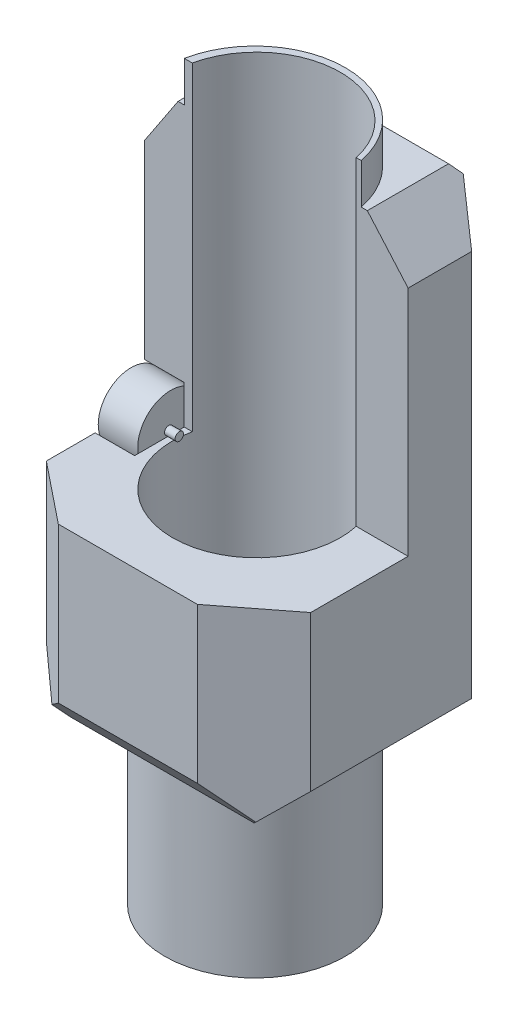
ISO-10303-21;
HEADER;
FILE_DESCRIPTION(('STEP AP214'),'2;1');
FILE_NAME('part.step','',(''),(''),'','','');
FILE_SCHEMA(('AUTOMOTIVE_DESIGN { 1 0 10303 214 1 1 1 1 }'));
ENDSEC;
DATA;
#1=APPLICATION_CONTEXT('core data for automotive mechanical design processes');
#2=APPLICATION_PROTOCOL_DEFINITION('international standard','automotive_design',2000,#1);
#3=PRODUCT_CONTEXT('',#1,'mechanical');
#4=PRODUCT('Part','Part','',(#3));
#5=PRODUCT_RELATED_PRODUCT_CATEGORY('part','',(#4));
#6=PRODUCT_DEFINITION_FORMATION('','',#4);
#7=PRODUCT_DEFINITION_CONTEXT('part definition',#1,'design');
#8=PRODUCT_DEFINITION('design','',#6,#7);
#9=PRODUCT_DEFINITION_SHAPE('','',#8);
#10=(LENGTH_UNIT() NAMED_UNIT(*) SI_UNIT(.MILLI.,.METRE.));
#11=(NAMED_UNIT(*) PLANE_ANGLE_UNIT() SI_UNIT($,.RADIAN.));
#12=(NAMED_UNIT(*) SI_UNIT($,.STERADIAN.) SOLID_ANGLE_UNIT());
#13=UNCERTAINTY_MEASURE_WITH_UNIT(LENGTH_MEASURE(1.E-05),#10,'distance_accuracy_value','');
#14=(GEOMETRIC_REPRESENTATION_CONTEXT(3) GLOBAL_UNCERTAINTY_ASSIGNED_CONTEXT((#13)) GLOBAL_UNIT_ASSIGNED_CONTEXT((#10,
#11,#12)) REPRESENTATION_CONTEXT('',''));
#15=CARTESIAN_POINT('',(0.,0.,0.));
#16=DIRECTION('',(0.,0.,1.));
#17=DIRECTION('',(1.,0.,0.));
#18=AXIS2_PLACEMENT_3D('',#15,#16,#17);
#19=CARTESIAN_POINT('',(0.,180.,0.));
#20=DIRECTION('',(-1.,0.,0.));
#21=DIRECTION('',(0.,0.,1.));
#22=AXIS2_PLACEMENT_3D('',#19,#20,#21);
#23=PLANE('',#22);
#24=DIRECTION('',(0.,0.,1.));
#25=VECTOR('',#24,1.);
#26=CARTESIAN_POINT('',(0.,162.25857257587,0.));
#27=LINE('',#26,#25);
#28=CARTESIAN_POINT('',(0.,162.25857257587,-79.942972796148));
#29=VERTEX_POINT('',#28);
#30=CARTESIAN_POINT('',(0.,162.25857257587,-55.8113966630778));
#31=VERTEX_POINT('',#30);
#32=EDGE_CURVE('E299',#29,#31,#27,.T.);
#33=ORIENTED_EDGE('',*,*,#32,.T.);
#34=DIRECTION('',(0.,-1.,0.));
#35=VECTOR('',#34,1.);
#36=CARTESIAN_POINT('',(0.,180.,-55.8113966630778));
#37=LINE('',#36,#35);
#38=CARTESIAN_POINT('',(0.,74.0838599725127,-55.8113966630778));
#39=VERTEX_POINT('',#38);
#40=EDGE_CURVE('E228',#31,#39,#37,.T.);
#41=ORIENTED_EDGE('',*,*,#40,.T.);
#42=DIRECTION('',(0.,0.,1.));
#43=VECTOR('',#42,1.);
#44=CARTESIAN_POINT('',(0.,74.0838599725127,0.));
#45=LINE('',#44,#43);
#46=CARTESIAN_POINT('',(0.,74.0838599725127,-18.835743686039));
#47=VERTEX_POINT('',#46);
#48=EDGE_CURVE('E216',#39,#47,#45,.T.);
#49=ORIENTED_EDGE('',*,*,#48,.T.);
#50=DIRECTION('',(0.,-1.,0.));
#51=VECTOR('',#50,1.);
#52=CARTESIAN_POINT('',(0.,180.,-18.835743686039));
#53=LINE('',#52,#51);
#54=CARTESIAN_POINT('',(0.,15.2573853040028,-18.835743686039));
#55=VERTEX_POINT('',#54);
#56=EDGE_CURVE('E260',#47,#55,#53,.T.);
#57=ORIENTED_EDGE('',*,*,#56,.T.);
#58=DIRECTION('',(0.,0.,1.));
#59=VECTOR('',#58,1.);
#60=CARTESIAN_POINT('',(0.,15.2573853040028,-400.));
#61=LINE('',#60,#59);
#62=CARTESIAN_POINT('',(0.,15.2573853040028,-79.942972796148));
#63=VERTEX_POINT('',#62);
#64=EDGE_CURVE('E285',#63,#55,#61,.T.);
#65=ORIENTED_EDGE('',*,*,#64,.F.);
#66=DIRECTION('',(0.,1.,0.));
#67=VECTOR('',#66,1.);
#68=CARTESIAN_POINT('',(0.,180.,-79.942972796148));
#69=LINE('',#68,#67);
#70=EDGE_CURVE('E245',#63,#29,#69,.T.);
#71=ORIENTED_EDGE('',*,*,#70,.T.);
#72=EDGE_LOOP('',(#33,#41,#49,#57,#65,#71));
#73=FACE_BOUND('',#72,.T.);
#74=ADVANCED_FACE('F33',(#73),#23,.F.);
#75=CARTESIAN_POINT('',(0.,180.,-100.));
#76=DIRECTION('',(0.,0.,1.));
#77=DIRECTION('',(1.,0.,0.));
#78=AXIS2_PLACEMENT_3D('',#75,#76,#77);
#79=PLANE('',#78);
#80=DIRECTION('',(-1.,0.,0.));
#81=VECTOR('',#80,1.);
#82=CARTESIAN_POINT('',(0.,11.2531638573118,-100.));
#83=LINE('',#82,#81);
#84=CARTESIAN_POINT('',(-26.8680350721203,11.2531638573118,-100.));
#85=VERTEX_POINT('',#84);
#86=CARTESIAN_POINT('',(-78.23623075056,11.2531638573118,-100.));
#87=VERTEX_POINT('',#86);
#88=EDGE_CURVE('E323',#85,#87,#83,.T.);
#89=ORIENTED_EDGE('',*,*,#88,.T.);
#90=DIRECTION('',(0.,1.,0.));
#91=VECTOR('',#90,1.);
#92=CARTESIAN_POINT('',(-78.23623075056,180.,-100.));
#93=LINE('',#92,#91);
#94=CARTESIAN_POINT('',(-78.23623075056,164.310416887307,-100.));
#95=VERTEX_POINT('',#94);
#96=EDGE_CURVE('E276',#87,#95,#93,.T.);
#97=ORIENTED_EDGE('',*,*,#96,.T.);
#98=DIRECTION('',(1.,0.,0.));
#99=VECTOR('',#98,1.);
#100=CARTESIAN_POINT('',(0.,164.310416887307,-100.));
#101=LINE('',#100,#99);
#102=CARTESIAN_POINT('',(-26.8680350721203,164.310416887307,-100.));
#103=VERTEX_POINT('',#102);
#104=EDGE_CURVE('E326',#95,#103,#101,.T.);
#105=ORIENTED_EDGE('',*,*,#104,.T.);
#106=DIRECTION('',(0.,-1.,0.));
#107=VECTOR('',#106,1.);
#108=CARTESIAN_POINT('',(-26.8680350721203,180.,-100.));
#109=LINE('',#108,#107);
#110=EDGE_CURVE('E242',#103,#85,#109,.T.);
#111=ORIENTED_EDGE('',*,*,#110,.T.);
#112=EDGE_LOOP('',(#89,#97,#105,#111));
#113=FACE_BOUND('',#112,.T.);
#114=ADVANCED_FACE('F480',(#113),#79,.F.);
#115=CARTESIAN_POINT('',(-100.,180.,0.));
#116=DIRECTION('',(1.,0.,0.));
#117=DIRECTION('',(0.,0.,-1.));
#118=AXIS2_PLACEMENT_3D('',#115,#116,#117);
#119=PLANE('',#118);
#120=DIRECTION('',(0.,0.,1.));
#121=VECTOR('',#120,1.);
#122=CARTESIAN_POINT('',(-100.,74.0838599725127,-55.8113966630778));
#123=LINE('',#122,#121);
#124=CARTESIAN_POINT('',(-100.,74.0838599725127,-36.9860582028305));
#125=VERTEX_POINT('',#124);
#126=CARTESIAN_POINT('',(-100.,74.0838599725127,-18.4618277268646));
#127=VERTEX_POINT('',#126);
#128=EDGE_CURVE('E409',#125,#127,#123,.T.);
#129=ORIENTED_EDGE('',*,*,#128,.F.);
#130=CARTESIAN_POINT('',(-100.,76.2646461421603,-50.4132519540335));
#131=DIRECTION('',(-1.,0.,0.));
#132=DIRECTION('',(0.,0.,1.));
#133=AXIS2_PLACEMENT_3D('',#130,#131,#132);
#134=CIRCLE('',#133,13.603137886167);
#135=CARTESIAN_POINT('',(-100.,88.7508542955706,-55.8113966630778));
#136=VERTEX_POINT('',#135);
#137=EDGE_CURVE('E455',#136,#125,#134,.T.);
#138=ORIENTED_EDGE('',*,*,#137,.F.);
#139=DIRECTION('',(0.,-1.,0.));
#140=VECTOR('',#139,1.);
#141=CARTESIAN_POINT('',(-100.,74.0838599725127,-55.8113966630778));
#142=LINE('',#141,#140);
#143=CARTESIAN_POINT('',(-100.,160.896793159201,-55.8113966630778));
#144=VERTEX_POINT('',#143);
#145=EDGE_CURVE('E412',#144,#136,#142,.T.);
#146=ORIENTED_EDGE('',*,*,#145,.F.);
#147=DIRECTION('',(0.,0.,-1.));
#148=VECTOR('',#147,1.);
#149=CARTESIAN_POINT('',(-100.,160.896793159201,0.));
#150=LINE('',#149,#148);
#151=CARTESIAN_POINT('',(-100.,160.896793159201,-80.507743362499));
#152=VERTEX_POINT('',#151);
#153=EDGE_CURVE('E310',#144,#152,#150,.T.);
#154=ORIENTED_EDGE('',*,*,#153,.T.);
#155=DIRECTION('',(0.,-1.,0.));
#156=VECTOR('',#155,1.);
#157=CARTESIAN_POINT('',(-100.,180.,-80.507743362499));
#158=LINE('',#157,#156);
#159=CARTESIAN_POINT('',(-100.,14.8474354345408,-80.507743362499));
#160=VERTEX_POINT('',#159);
#161=EDGE_CURVE('E273',#152,#160,#158,.T.);
#162=ORIENTED_EDGE('',*,*,#161,.T.);
#163=DIRECTION('',(0.,0.,1.));
#164=VECTOR('',#163,1.);
#165=CARTESIAN_POINT('',(-100.,14.8474354345408,0.));
#166=LINE('',#165,#164);
#167=CARTESIAN_POINT('',(-100.,14.8474354345408,-18.4618277268646));
#168=VERTEX_POINT('',#167);
#169=EDGE_CURVE('E312',#160,#168,#166,.T.);
#170=ORIENTED_EDGE('',*,*,#169,.T.);
#171=DIRECTION('',(0.,1.,0.));
#172=VECTOR('',#171,1.);
#173=CARTESIAN_POINT('',(-100.,180.,-18.4618277268646));
#174=LINE('',#173,#172);
#175=EDGE_CURVE('E267',#168,#127,#174,.T.);
#176=ORIENTED_EDGE('',*,*,#175,.T.);
#177=EDGE_LOOP('',(#129,#138,#146,#154,#162,#170,#176));
#178=FACE_BOUND('',#177,.T.);
#179=ADVANCED_FACE('F467',(#178),#119,.F.);
#180=CARTESIAN_POINT('',(0.,180.,0.));
#181=DIRECTION('',(0.,0.,-1.));
#182=DIRECTION('',(-1.,0.,0.));
#183=AXIS2_PLACEMENT_3D('',#180,#181,#182);
#184=PLANE('',#183);
#185=DIRECTION('',(0.,1.,0.));
#186=VECTOR('',#185,1.);
#187=CARTESIAN_POINT('',(-24.2126205432622,180.,0.));
#188=LINE('',#187,#186);
#189=CARTESIAN_POINT('',(-24.2126205432622,15.2573853040028,0.));
#190=VERTEX_POINT('',#189);
#191=CARTESIAN_POINT('',(-24.2126205432622,74.0838599725127,0.));
#192=VERTEX_POINT('',#191);
#193=EDGE_CURVE('E257',#190,#192,#188,.T.);
#194=ORIENTED_EDGE('',*,*,#193,.T.);
#195=DIRECTION('',(-1.,0.,0.));
#196=VECTOR('',#195,1.);
#197=CARTESIAN_POINT('',(0.,74.0838599725127,0.));
#198=LINE('',#197,#196);
#199=CARTESIAN_POINT('',(-76.9899954986816,74.0838599725127,0.));
#200=VERTEX_POINT('',#199);
#201=EDGE_CURVE('E418',#192,#200,#198,.T.);
#202=ORIENTED_EDGE('',*,*,#201,.T.);
#203=DIRECTION('',(0.,-1.,0.));
#204=VECTOR('',#203,1.);
#205=CARTESIAN_POINT('',(-76.9899954986816,180.,0.));
#206=LINE('',#205,#204);
#207=CARTESIAN_POINT('',(-76.9899954986816,15.2573853040028,0.));
#208=VERTEX_POINT('',#207);
#209=EDGE_CURVE('E265',#200,#208,#206,.T.);
#210=ORIENTED_EDGE('',*,*,#209,.T.);
#211=DIRECTION('',(1.,0.,0.));
#212=VECTOR('',#211,1.);
#213=CARTESIAN_POINT('',(0.,15.2573853040028,0.));
#214=LINE('',#213,#212);
#215=EDGE_CURVE('E320',#208,#190,#214,.T.);
#216=ORIENTED_EDGE('',*,*,#215,.T.);
#217=EDGE_LOOP('',(#194,#202,#210,#216));
#218=FACE_BOUND('',#217,.T.);
#219=ADVANCED_FACE('F426',(#218),#184,.F.);
#220=CARTESIAN_POINT('',(0.,180.,0.));
#221=DIRECTION('',(0.,1.,0.));
#222=DIRECTION('',(0.,0.,1.));
#223=AXIS2_PLACEMENT_3D('',#220,#221,#222);
#224=PLANE('',#223);
#225=DIRECTION('',(-1.,0.,0.));
#226=VECTOR('',#225,1.);
#227=CARTESIAN_POINT('',(0.,180.,-55.8113966630778));
#228=LINE('',#227,#226);
#229=CARTESIAN_POINT('',(-15.4785584814981,180.,-55.8113966630778));
#230=VERTEX_POINT('',#229);
#231=CARTESIAN_POINT('',(-17.7880398883026,180.,-55.8113966630778));
#232=VERTEX_POINT('',#231);
#233=EDGE_CURVE('E214',#230,#232,#228,.T.);
#234=ORIENTED_EDGE('',*,*,#233,.F.);
#235=DIRECTION('',(0.,0.,1.));
#236=VECTOR('',#235,1.);
#237=CARTESIAN_POINT('',(-15.4785584814982,180.,0.));
#238=LINE('',#237,#236);
#239=CARTESIAN_POINT('',(-15.4785584814982,180.,-86.6502872632608));
#240=VERTEX_POINT('',#239);
#241=EDGE_CURVE('E296',#240,#230,#238,.T.);
#242=ORIENTED_EDGE('',*,*,#241,.F.);
#243=DIRECTION('',(1.,0.,0.));
#244=VECTOR('',#243,1.);
#245=CARTESIAN_POINT('',(0.,180.,-86.6502872632607));
#246=LINE('',#245,#244);
#247=CARTESIAN_POINT('',(-87.3310077399419,180.,-86.6502872632608));
#248=VERTEX_POINT('',#247);
#249=EDGE_CURVE('E340',#248,#240,#246,.T.);
#250=ORIENTED_EDGE('',*,*,#249,.F.);
#251=DIRECTION('',(0.,0.,-1.));
#252=VECTOR('',#251,1.);
#253=CARTESIAN_POINT('',(-87.3310077399419,180.,0.));
#254=LINE('',#253,#252);
#255=CARTESIAN_POINT('',(-87.3310077399419,180.,-55.8113966630778));
#256=VERTEX_POINT('',#255);
#257=EDGE_CURVE('E305',#256,#248,#254,.T.);
#258=ORIENTED_EDGE('',*,*,#257,.F.);
#259=CARTESIAN_POINT('',(-84.9665437781077,180.,-55.8113966630778));
#260=VERTEX_POINT('',#259);
#261=EDGE_CURVE('E220',#260,#256,#228,.T.);
#262=ORIENTED_EDGE('',*,*,#261,.F.);
#263=CARTESIAN_POINT('',(-51.3772918332052,180.,-49.0765363844359));
#264=DIRECTION('',(0.,1.,0.));
#265=DIRECTION('',(0.,0.,1.));
#266=AXIS2_PLACEMENT_3D('',#263,#264,#265);
#267=CIRCLE('',#266,34.2577901971357);
#268=EDGE_CURVE('E329',#260,#232,#267,.F.);
#269=ORIENTED_EDGE('',*,*,#268,.T.);
#270=EDGE_LOOP('',(#234,#242,#250,#258,#262,#269));
#271=FACE_BOUND('',#270,.T.);
#272=ADVANCED_FACE('F523',(#271),#224,.T.);
#273=CARTESIAN_POINT('',(0.,0.,0.));
#274=DIRECTION('',(0.,1.,0.));
#275=DIRECTION('',(0.,0.,1.));
#276=AXIS2_PLACEMENT_3D('',#273,#274,#275);
#277=PLANE('',#276);
#278=DIRECTION('',(1.,0.,0.));
#279=VECTOR('',#278,1.);
#280=CARTESIAN_POINT('',(0.,0.,-86.7744382892866));
#281=LINE('',#280,#279);
#282=CARTESIAN_POINT('',(-85.6232873351068,0.,-86.7744382892867));
#283=VERTEX_POINT('',#282);
#284=CARTESIAN_POINT('',(-15.6949887514202,0.,-86.7744382892866));
#285=VERTEX_POINT('',#284);
#286=EDGE_CURVE('E337',#283,#285,#281,.T.);
#287=ORIENTED_EDGE('',*,*,#286,.T.);
#288=DIRECTION('',(0.,0.,1.));
#289=VECTOR('',#288,1.);
#290=CARTESIAN_POINT('',(-15.6949887514202,0.,-400.));
#291=LINE('',#290,#289);
#292=CARTESIAN_POINT('',(-15.6949887514202,0.,-12.9819708694115));
#293=VERTEX_POINT('',#292);
#294=EDGE_CURVE('E286',#285,#293,#291,.T.);
#295=ORIENTED_EDGE('',*,*,#294,.T.);
#296=DIRECTION('',(-1.,0.,0.));
#297=VECTOR('',#296,1.);
#298=CARTESIAN_POINT('',(0.,0.,-12.9819708694114));
#299=LINE('',#298,#297);
#300=CARTESIAN_POINT('',(-85.6232873351069,0.,-12.9819708694114));
#301=VERTEX_POINT('',#300);
#302=EDGE_CURVE('E334',#293,#301,#299,.T.);
#303=ORIENTED_EDGE('',*,*,#302,.T.);
#304=DIRECTION('',(0.,0.,1.));
#305=VECTOR('',#304,1.);
#306=CARTESIAN_POINT('',(-85.6232873351068,0.,-400.));
#307=LINE('',#306,#305);
#308=CARTESIAN_POINT('',(-85.6232873351068,0.,-48.1776585981388));
#309=VERTEX_POINT('',#308);
#310=EDGE_CURVE('E289',#309,#301,#307,.T.);
#311=ORIENTED_EDGE('',*,*,#310,.F.);
#312=CARTESIAN_POINT('',(-51.3772918332052,0.,-49.0765363844359));
#313=DIRECTION('',(0.,1.,0.));
#314=DIRECTION('',(0.,0.,1.));
#315=AXIS2_PLACEMENT_3D('',#312,#313,#314);
#316=CIRCLE('',#315,34.2577901971357);
#317=CARTESIAN_POINT('',(-85.6232873351068,0.,-49.9754141707329));
#318=VERTEX_POINT('',#317);
#319=EDGE_CURVE('E331',#318,#309,#316,.F.);
#320=ORIENTED_EDGE('',*,*,#319,.F.);
#321=EDGE_CURVE('E295',#283,#318,#307,.T.);
#322=ORIENTED_EDGE('',*,*,#321,.F.);
#323=EDGE_LOOP('',(#287,#295,#303,#311,#320,#322));
#324=FACE_BOUND('',#323,.T.);
#325=ADVANCED_FACE('F493',(#324),#277,.F.);
#326=CARTESIAN_POINT('',(-51.3772918332052,530.,-49.0765363844359));
#327=DIRECTION('',(0.,-1.,0.));
#328=DIRECTION('',(0.,0.,-1.));
#329=AXIS2_PLACEMENT_3D('',#326,#327,#328);
#330=CYLINDRICAL_SURFACE('',#329,34.2577901971357);
#331=CARTESIAN_POINT('',(-51.3772918332052,-62.6813888831705,-49.0765363844359));
#332=DIRECTION('',(0.,1.,0.));
#333=DIRECTION('',(0.,0.,1.));
#334=AXIS2_PLACEMENT_3D('',#331,#332,#333);
#335=CIRCLE('',#334,34.2577901971357);
#336=CARTESIAN_POINT('',(-51.3772918332052,-62.6813888831705,-14.8187461873002));
#337=VERTEX_POINT('',#336);
#338=EDGE_CURVE('E238',#337,#337,#335,.T.);
#339=ORIENTED_EDGE('',*,*,#338,.T.);
#340=EDGE_LOOP('',(#339));
#341=FACE_BOUND('',#340,.T.);
#342=ORIENTED_EDGE('',*,*,#319,.T.);
#343=CARTESIAN_POINT('',(-51.3772918332052,86.1655593743765,-49.0765363844359));
#344=DIRECTION('',(0.929293452580676,-0.369342224760028,0.));
#345=DIRECTION('',(-0.369342224760028,-0.929293452580676,0.));
#346=AXIS2_PLACEMENT_3D('',#343,#344,#345);
#347=ELLIPSE('',#346,92.7535166589576,34.2577901971357);
#348=EDGE_CURVE('E348',#309,#318,#347,.T.);
#349=ORIENTED_EDGE('',*,*,#348,.T.);
#350=EDGE_LOOP('',(#342,#349));
#351=FACE_BOUND('',#350,.T.);
#352=ADVANCED_FACE('F497',(#341,#351),#330,.T.);
#353=DIRECTION('',(0.,-1.,0.));
#354=VECTOR('',#353,1.);
#355=CARTESIAN_POINT('',(-84.9665437781077,530.,-55.8113966630778));
#356=LINE('',#355,#354);
#357=CARTESIAN_POINT('',(-84.9665437781077,195.325913024433,-55.8113966630778));
#358=VERTEX_POINT('',#357);
#359=EDGE_CURVE('E209',#260,#358,#356,.F.);
#360=ORIENTED_EDGE('',*,*,#359,.T.);
#361=CARTESIAN_POINT('',(-51.3772918332052,195.325913024433,-49.0765363844359));
#362=DIRECTION('',(0.,-1.,0.));
#363=DIRECTION('',(0.,0.,-1.));
#364=AXIS2_PLACEMENT_3D('',#361,#362,#363);
#365=CIRCLE('',#364,34.2577901971357);
#366=CARTESIAN_POINT('',(-17.7880398883026,195.325913024433,-55.8113966630778));
#367=VERTEX_POINT('',#366);
#368=EDGE_CURVE('E197',#358,#367,#365,.T.);
#369=ORIENTED_EDGE('',*,*,#368,.T.);
#370=DIRECTION('',(0.,-1.,0.));
#371=VECTOR('',#370,1.);
#372=CARTESIAN_POINT('',(-17.7880398883026,530.,-55.8113966630778));
#373=LINE('',#372,#371);
#374=EDGE_CURVE('E207',#367,#232,#373,.T.);
#375=ORIENTED_EDGE('',*,*,#374,.T.);
#376=ORIENTED_EDGE('',*,*,#268,.F.);
#377=EDGE_LOOP('',(#360,#369,#375,#376));
#378=FACE_BOUND('',#377,.T.);
#379=ADVANCED_FACE('F205',(#378),#330,.T.);
#380=CARTESIAN_POINT('',(-400.,0.,-12.9819708694114));
#381=DIRECTION('',(0.,0.648030679802751,-0.761614231769854));
#382=DIRECTION('',(0.,0.761614231769854,0.648030679802751));
#383=AXIS2_PLACEMENT_3D('',#380,#381,#382);
#384=PLANE('',#383);
#385=DIRECTION('',(0.61672298954482,0.599527685323787,0.51011695590051));
#386=VECTOR('',#385,1.);
#387=CARTESIAN_POINT('',(-161.864341339676,-142.093898084117,-133.884655627931));
#388=LINE('',#387,#386);
#389=CARTESIAN_POINT('',(-11.7351397334046,3.84944157466014,-9.70661684314665));
#390=VERTEX_POINT('',#389);
#391=EDGE_CURVE('E317',#293,#390,#388,.T.);
#392=ORIENTED_EDGE('',*,*,#391,.T.);
#393=DIRECTION('',(-0.640041580283072,0.585178886954522,0.49790806959861));
#394=VECTOR('',#393,1.);
#395=CARTESIAN_POINT('',(-168.303530456469,146.997198592356,112.092759301453));
#396=LINE('',#395,#394);
#397=EDGE_CURVE('E254',#390,#190,#396,.T.);
#398=ORIENTED_EDGE('',*,*,#397,.T.);
#399=ORIENTED_EDGE('',*,*,#215,.F.);
#400=DIRECTION('',(-0.628329778342481,-0.592495582556801,-0.504133587751069));
#401=VECTOR('',#400,1.);
#402=CARTESIAN_POINT('',(-214.306055792962,-114.227420195886,-110.174052731693));
#403=LINE('',#402,#401);
#404=CARTESIAN_POINT('',(-89.2252600270588,3.71990859296577,-9.81683188730251));
#405=VERTEX_POINT('',#404);
#406=EDGE_CURVE('E262',#208,#405,#403,.T.);
#407=ORIENTED_EDGE('',*,*,#406,.T.);
#408=DIRECTION('',(0.593525479967305,-0.612958709544806,-0.521544940559053));
#409=VECTOR('',#408,1.);
#410=CARTESIAN_POINT('',(-196.369556391918,114.372326815193,84.3334069228837));
#411=LINE('',#410,#409);
#412=EDGE_CURVE('E315',#405,#301,#411,.T.);
#413=ORIENTED_EDGE('',*,*,#412,.T.);
#414=ORIENTED_EDGE('',*,*,#302,.F.);
#415=EDGE_LOOP('',(#392,#398,#399,#407,#413,#414));
#416=FACE_BOUND('',#415,.T.);
#417=ADVANCED_FACE('F431',(#416),#384,.F.);
#418=CARTESIAN_POINT('',(-400.,-1.44810398413053,-85.072517936176));
#419=DIRECTION('',(0.,0.761614231769854,0.648030679802751));
#420=DIRECTION('',(0.,-0.648030679802751,0.761614231769854));
#421=AXIS2_PLACEMENT_3D('',#418,#419,#420);
#422=PLANE('',#421);
#423=DIRECTION('',(-0.531512068777104,0.548914853332077,-0.645125882704847));
#424=VECTOR('',#423,1.);
#425=CARTESIAN_POINT('',(-173.430238872661,90.6819294539596,-193.350639369007));
#426=LINE('',#425,#424);
#427=CARTESIAN_POINT('',(-88.756666543567,3.23597240717974,-90.5775956331223));
#428=VERTEX_POINT('',#427);
#429=EDGE_CURVE('E343',#283,#428,#426,.T.);
#430=ORIENTED_EDGE('',*,*,#429,.T.);
#431=DIRECTION('',(0.647811274519912,0.49367033016184,-0.580198377904305));
#432=VECTOR('',#431,1.);
#433=CARTESIAN_POINT('',(-222.939997158503,-99.0196253762684,29.6008480382685));
#434=LINE('',#433,#432);
#435=EDGE_CURVE('E270',#428,#87,#434,.T.);
#436=ORIENTED_EDGE('',*,*,#435,.T.);
#437=ORIENTED_EDGE('',*,*,#88,.F.);
#438=DIRECTION('',(0.71415681894842,-0.453612235752694,0.533119102569883));
#439=VECTOR('',#438,1.);
#440=CARTESIAN_POINT('',(-207.374856665364,125.905997435364,-234.7486044833));
#441=LINE('',#440,#439);
#442=CARTESIAN_POINT('',(-13.109045681771,2.51384250175289,-89.7288944368655));
#443=VERTEX_POINT('',#442);
#444=EDGE_CURVE('E239',#85,#443,#441,.T.);
#445=ORIENTED_EDGE('',*,*,#444,.T.);
#446=DIRECTION('',(-0.554671653885714,-0.539206448286052,0.633715837345437));
#447=VECTOR('',#446,1.);
#448=CARTESIAN_POINT('',(-134.961850638957,-115.941495380351,49.48869814313));
#449=LINE('',#448,#447);
#450=EDGE_CURVE('E346',#443,#285,#449,.T.);
#451=ORIENTED_EDGE('',*,*,#450,.T.);
#452=ORIENTED_EDGE('',*,*,#286,.F.);
#453=EDGE_LOOP('',(#430,#436,#437,#445,#451,#452));
#454=FACE_BOUND('',#453,.T.);
#455=ADVANCED_FACE('F483',(#454),#422,.F.);
#456=CARTESIAN_POINT('',(-400.,181.854312783962,-85.072517936176));
#457=DIRECTION('',(0.,-0.648030679802751,0.761614231769854));
#458=DIRECTION('',(0.,-0.761614231769854,-0.648030679802751));
#459=AXIS2_PLACEMENT_3D('',#456,#457,#458);
#460=PLANE('',#459);
#461=ORIENTED_EDGE('',*,*,#104,.F.);
#462=DIRECTION('',(-0.586196421620691,0.617036215494435,0.52501434651579));
#463=VECTOR('',#462,1.);
#464=CARTESIAN_POINT('',(-199.742515919054,292.209147745934,8.82451777669856));
#465=LINE('',#464,#463);
#466=CARTESIAN_POINT('',(-89.7197502262504,176.398084325205,-89.7150302341283));
#467=VERTEX_POINT('',#466);
#468=EDGE_CURVE('E282',#95,#467,#465,.T.);
#469=ORIENTED_EDGE('',*,*,#468,.T.);
#470=DIRECTION('',(0.450846295048029,0.679818082679197,0.578433222337588));
#471=VECTOR('',#470,1.);
#472=CARTESIAN_POINT('',(-149.905059314496,85.6463982645104,-166.932438152694));
#473=LINE('',#472,#471);
#474=EDGE_CURVE('E307',#467,#248,#473,.T.);
#475=ORIENTED_EDGE('',*,*,#474,.T.);
#476=ORIENTED_EDGE('',*,*,#249,.T.);
#477=DIRECTION('',(0.553434352005852,-0.634343010808712,-0.539740088059059));
#478=VECTOR('',#477,1.);
#479=CARTESIAN_POINT('',(-134.375755077368,316.279226961578,29.3048989806743));
#480=LINE('',#479,#478);
#481=CARTESIAN_POINT('',(-12.6631489460901,176.772995107952,-89.3960318760697));
#482=VERTEX_POINT('',#481);
#483=EDGE_CURVE('E302',#240,#482,#480,.T.);
#484=ORIENTED_EDGE('',*,*,#483,.T.);
#485=DIRECTION('',(-0.655544261905661,-0.575138129838513,-0.489364743609938));
#486=VECTOR('',#485,1.);
#487=CARTESIAN_POINT('',(-175.813834897368,33.6336438044814,-211.188255894991));
#488=LINE('',#487,#486);
#489=EDGE_CURVE('E251',#482,#103,#488,.T.);
#490=ORIENTED_EDGE('',*,*,#489,.T.);
#491=EDGE_LOOP('',(#461,#469,#475,#476,#484,#490));
#492=FACE_BOUND('',#491,.T.);
#493=ADVANCED_FACE('F477',(#492),#460,.F.);
#494=CARTESIAN_POINT('',(-15.6949887514202,180.248071028759,-400.));
#495=DIRECTION('',(-0.753527099389569,-0.657416846822123,0.));
#496=DIRECTION('',(0.657416846822123,-0.753527099389569,0.));
#497=AXIS2_PLACEMENT_3D('',#494,#495,#496);
#498=PLANE('',#497);
#499=ORIENTED_EDGE('',*,*,#241,.T.);
#500=DIRECTION('',(0.657416846822123,-0.753527099389569,0.));
#501=VECTOR('',#500,1.);
#502=CARTESIAN_POINT('',(-15.6949887514202,180.248071028759,-55.8113966630778));
#503=LINE('',#502,#501);
#504=EDGE_CURVE('E218',#230,#31,#503,.T.);
#505=ORIENTED_EDGE('',*,*,#504,.T.);
#506=ORIENTED_EDGE('',*,*,#32,.F.);
#507=DIRECTION('',(-0.590175998555204,0.676456057477596,-0.440567240079464));
#508=VECTOR('',#507,1.);
#509=CARTESIAN_POINT('',(-95.8673346312649,272.14111504508,-151.508077333892));
#510=LINE('',#509,#508);
#511=EDGE_CURVE('E248',#29,#482,#510,.T.);
#512=ORIENTED_EDGE('',*,*,#511,.T.);
#513=ORIENTED_EDGE('',*,*,#483,.F.);
#514=EDGE_LOOP('',(#499,#505,#506,#512,#513));
#515=FACE_BOUND('',#514,.T.);
#516=ADVANCED_FACE('F507',(#515),#498,.F.);
#517=CARTESIAN_POINT('',(-87.166490338781,180.248071028759,-400.));
#518=DIRECTION('',(0.833386414729428,-0.552690766834791,0.));
#519=DIRECTION('',(0.552690766834791,0.833386414729428,0.));
#520=AXIS2_PLACEMENT_3D('',#517,#518,#519);
#521=PLANE('',#520);
#522=ORIENTED_EDGE('',*,*,#153,.F.);
#523=DIRECTION('',(0.552690766834791,0.833386414729428,0.));
#524=VECTOR('',#523,1.);
#525=CARTESIAN_POINT('',(-87.166490338781,180.248071028759,-55.8113966630778));
#526=LINE('',#525,#524);
#527=EDGE_CURVE('E232',#144,#256,#526,.T.);
#528=ORIENTED_EDGE('',*,*,#527,.T.);
#529=ORIENTED_EDGE('',*,*,#257,.T.);
#530=ORIENTED_EDGE('',*,*,#474,.F.);
#531=DIRECTION('',(-0.495327209718188,-0.746889566816963,0.443629271230791));
#532=VECTOR('',#531,1.);
#533=CARTESIAN_POINT('',(-19.4864586420873,282.300832444514,-152.617982767967));
#534=LINE('',#533,#532);
#535=EDGE_CURVE('E279',#467,#152,#534,.T.);
#536=ORIENTED_EDGE('',*,*,#535,.T.);
#537=EDGE_LOOP('',(#522,#528,#529,#530,#536));
#538=FACE_BOUND('',#537,.T.);
#539=ADVANCED_FACE('F470',(#538),#521,.F.);
#540=CARTESIAN_POINT('',(-93.5263452614059,-19.8847017587749,-400.));
#541=DIRECTION('',(0.929293452580676,-0.369342224760028,0.));
#542=DIRECTION('',(0.369342224760028,0.929293452580676,0.));
#543=AXIS2_PLACEMENT_3D('',#540,#541,#542);
#544=PLANE('',#543);
#545=EDGE_CURVE('E294',#318,#309,#307,.T.);
#546=ORIENTED_EDGE('',*,*,#545,.F.);
#547=ORIENTED_EDGE('',*,*,#348,.F.);
#548=EDGE_LOOP('',(#546,#547));
#549=FACE_BOUND('',#548,.T.);
#550=ADVANCED_FACE('F498',(#549),#544,.F.);
#551=CARTESIAN_POINT('',(-85.6232873351068,0.,-400.));
#552=DIRECTION('',(0.718403190633828,0.695626951524404,0.));
#553=DIRECTION('',(-0.695626951524404,0.718403190633828,0.));
#554=AXIS2_PLACEMENT_3D('',#551,#552,#553);
#555=PLANE('',#554);
#556=ORIENTED_EDGE('',*,*,#169,.F.);
#557=DIRECTION('',(0.590414359571925,-0.609745724749451,-0.528792052853521));
#558=VECTOR('',#557,1.);
#559=CARTESIAN_POINT('',(10.1042154435278,-98.861815628153,-179.120240108721));
#560=LINE('',#559,#558);
#561=EDGE_CURVE('E360',#160,#428,#560,.T.);
#562=ORIENTED_EDGE('',*,*,#561,.T.);
#563=ORIENTED_EDGE('',*,*,#429,.F.);
#564=ORIENTED_EDGE('',*,*,#321,.T.);
#565=ORIENTED_EDGE('',*,*,#545,.T.);
#566=ORIENTED_EDGE('',*,*,#310,.T.);
#567=ORIENTED_EDGE('',*,*,#412,.F.);
#568=DIRECTION('',(-0.60742264461239,0.627310895583479,-0.487358975596371));
#569=VECTOR('',#568,1.);
#570=CARTESIAN_POINT('',(-201.985869600553,120.172529524189,-100.289084867645));
#571=LINE('',#570,#569);
#572=EDGE_CURVE('E357',#405,#168,#571,.T.);
#573=ORIENTED_EDGE('',*,*,#572,.T.);
#574=EDGE_LOOP('',(#556,#562,#563,#564,#565,#566,#567,#573));
#575=FACE_BOUND('',#574,.T.);
#576=ADVANCED_FACE('F489',(#575),#555,.F.);
#577=CARTESIAN_POINT('',(-15.6949887514202,0.,-400.));
#578=DIRECTION('',(-0.697040073938311,0.717032171749687,0.));
#579=DIRECTION('',(-0.717032171749687,-0.697040073938311,0.));
#580=AXIS2_PLACEMENT_3D('',#577,#578,#579);
#581=PLANE('',#580);
#582=ORIENTED_EDGE('',*,*,#64,.T.);
#583=DIRECTION('',(-0.626200927331214,-0.608741361802611,0.487140999137037));
#584=VECTOR('',#583,1.);
#585=CARTESIAN_POINT('',(104.302981271785,116.652218955974,-99.9762471443389));
#586=LINE('',#585,#584);
#587=EDGE_CURVE('E354',#55,#390,#586,.T.);
#588=ORIENTED_EDGE('',*,*,#587,.T.);
#589=ORIENTED_EDGE('',*,*,#391,.F.);
#590=ORIENTED_EDGE('',*,*,#294,.F.);
#591=ORIENTED_EDGE('',*,*,#450,.F.);
#592=DIRECTION('',(0.63216753808039,0.614541613118557,0.471913985322559));
#593=VECTOR('',#592,1.);
#594=CARTESIAN_POINT('',(-107.681868244315,-89.4221261043572,-160.32764383519));
#595=LINE('',#594,#593);
#596=EDGE_CURVE('E351',#443,#63,#595,.T.);
#597=ORIENTED_EDGE('',*,*,#596,.T.);
#598=EDGE_LOOP('',(#582,#588,#589,#590,#591,#597));
#599=FACE_BOUND('',#598,.T.);
#600=ADVANCED_FACE('F435',(#599),#581,.F.);
#601=CARTESIAN_POINT('',(-31.7243853522426,-220.,-103.625272537362));
#602=DIRECTION('',(-0.598204225918444,0.,0.801343686624731));
#603=DIRECTION('',(0.801343686624731,0.,0.598204225918444));
#604=AXIS2_PLACEMENT_3D('',#601,#602,#603);
#605=PLANE('',#604);
#606=ORIENTED_EDGE('',*,*,#511,.F.);
#607=ORIENTED_EDGE('',*,*,#70,.F.);
#608=ORIENTED_EDGE('',*,*,#596,.F.);
#609=ORIENTED_EDGE('',*,*,#444,.F.);
#610=ORIENTED_EDGE('',*,*,#110,.F.);
#611=ORIENTED_EDGE('',*,*,#489,.F.);
#612=EDGE_LOOP('',(#606,#607,#608,#609,#610,#611));
#613=FACE_BOUND('',#612,.T.);
#614=ADVANCED_FACE('F547',(#613),#605,.F.);
#615=CARTESIAN_POINT('',(-38.5315768457559,-220.,11.1391573780071));
#616=DIRECTION('',(-0.614015874090284,0.,-0.789293675614561));
#617=DIRECTION('',(-0.789293675614561,0.,0.614015874090284));
#618=AXIS2_PLACEMENT_3D('',#615,#616,#617);
#619=PLANE('',#618);
#620=ORIENTED_EDGE('',*,*,#56,.F.);
#621=DIRECTION('',(-0.789293675614561,0.,0.614015874090284));
#622=VECTOR('',#621,1.);
#623=CARTESIAN_POINT('',(-38.5315768457559,74.0838599725127,11.1391573780071));
#624=LINE('',#623,#622);
#625=EDGE_CURVE('E222',#47,#192,#624,.T.);
#626=ORIENTED_EDGE('',*,*,#625,.T.);
#627=ORIENTED_EDGE('',*,*,#193,.F.);
#628=ORIENTED_EDGE('',*,*,#397,.F.);
#629=ORIENTED_EDGE('',*,*,#587,.F.);
#630=EDGE_LOOP('',(#620,#626,#627,#628,#629));
#631=FACE_BOUND('',#630,.T.);
#632=ADVANCED_FACE('F423',(#631),#619,.F.);
#633=CARTESIAN_POINT('',(-112.386997555001,-220.,-28.4004009635807));
#634=DIRECTION('',(0.625806910437033,0.,-0.779978019465456));
#635=DIRECTION('',(-0.779978019465456,0.,-0.625806910437033));
#636=AXIS2_PLACEMENT_3D('',#633,#634,#635);
#637=PLANE('',#636);
#638=ORIENTED_EDGE('',*,*,#209,.F.);
#639=DIRECTION('',(-0.779978019465456,0.,-0.625806910437033));
#640=VECTOR('',#639,1.);
#641=CARTESIAN_POINT('',(-112.386997555001,74.0838599725127,-28.4004009635807));
#642=LINE('',#641,#640);
#643=EDGE_CURVE('E411',#200,#127,#642,.T.);
#644=ORIENTED_EDGE('',*,*,#643,.T.);
#645=ORIENTED_EDGE('',*,*,#175,.F.);
#646=ORIENTED_EDGE('',*,*,#572,.F.);
#647=ORIENTED_EDGE('',*,*,#406,.F.);
#648=EDGE_LOOP('',(#638,#644,#645,#646,#647));
#649=FACE_BOUND('',#648,.T.);
#650=ADVANCED_FACE('F544',(#649),#637,.F.);
#651=CARTESIAN_POINT('',(-66.4286941720711,-220.,-110.575168786561));
#652=DIRECTION('',(0.66716375547024,0.,0.744911084215322));
#653=DIRECTION('',(0.744911084215322,0.,-0.66716375547024));
#654=AXIS2_PLACEMENT_3D('',#651,#652,#653);
#655=PLANE('',#654);
#656=ORIENTED_EDGE('',*,*,#96,.F.);
#657=ORIENTED_EDGE('',*,*,#435,.F.);
#658=ORIENTED_EDGE('',*,*,#561,.F.);
#659=ORIENTED_EDGE('',*,*,#161,.F.);
#660=ORIENTED_EDGE('',*,*,#535,.F.);
#661=ORIENTED_EDGE('',*,*,#468,.F.);
#662=EDGE_LOOP('',(#656,#657,#658,#659,#660,#661));
#663=FACE_BOUND('',#662,.T.);
#664=ADVANCED_FACE('F474',(#663),#655,.F.);
#665=CARTESIAN_POINT('',(-146.202949733734,-62.6813888831705,-400.));
#666=DIRECTION('',(0.,1.,0.));
#667=DIRECTION('',(0.,0.,1.));
#668=AXIS2_PLACEMENT_3D('',#665,#666,#667);
#669=PLANE('',#668);
#670=CARTESIAN_POINT('',(-50.8089931565134,-62.6813888831705,-49.0320363736778));
#671=DIRECTION('',(0.,1.,0.));
#672=DIRECTION('',(0.,0.,1.));
#673=AXIS2_PLACEMENT_3D('',#670,#671,#672);
#674=CIRCLE('',#673,31.8472934226778);
#675=CARTESIAN_POINT('',(-50.8089931565134,-62.6813888831705,-17.184742951));
#676=VERTEX_POINT('',#675);
#677=EDGE_CURVE('E235',#676,#676,#674,.T.);
#678=ORIENTED_EDGE('',*,*,#677,.T.);
#679=EDGE_LOOP('',(#678));
#680=FACE_BOUND('',#679,.T.);
#681=ORIENTED_EDGE('',*,*,#338,.F.);
#682=EDGE_LOOP('',(#681));
#683=FACE_BOUND('',#682,.T.);
#684=ADVANCED_FACE('F559',(#680,#683),#669,.F.);
#685=CARTESIAN_POINT('',(-50.8089931565134,-148.571165893615,-49.0320363736778));
#686=DIRECTION('',(0.,1.,0.));
#687=DIRECTION('',(0.,0.,1.));
#688=AXIS2_PLACEMENT_3D('',#685,#686,#687);
#689=CYLINDRICAL_SURFACE('',#688,31.8472934226778);
#690=DIRECTION('',(0.,1.,0.));
#691=VECTOR('',#690,1.);
#692=CARTESIAN_POINT('',(-19.6916286727297,-148.571165893615,-55.8113966630778));
#693=LINE('',#692,#691);
#694=CARTESIAN_POINT('',(-19.6916286727297,74.0838599725127,-55.8113966630778));
#695=VERTEX_POINT('',#694);
#696=CARTESIAN_POINT('',(-19.6916286727297,195.325913024433,-55.8113966630778));
#697=VERTEX_POINT('',#696);
#698=EDGE_CURVE('E368',#695,#697,#693,.T.);
#699=ORIENTED_EDGE('',*,*,#698,.T.);
#700=CARTESIAN_POINT('',(-50.8089931565134,195.325913024433,-49.0320363736778));
#701=DIRECTION('',(0.,-1.,0.));
#702=DIRECTION('',(0.,0.,-1.));
#703=AXIS2_PLACEMENT_3D('',#700,#701,#702);
#704=CIRCLE('',#703,31.8472934226778);
#705=CARTESIAN_POINT('',(-81.9263576402972,195.325913024433,-55.8113966630778));
#706=VERTEX_POINT('',#705);
#707=EDGE_CURVE('E47',#697,#706,#704,.F.);
#708=ORIENTED_EDGE('',*,*,#707,.T.);
#709=DIRECTION('',(0.,1.,0.));
#710=VECTOR('',#709,1.);
#711=CARTESIAN_POINT('',(-81.9263576402972,-148.571165893615,-55.8113966630778));
#712=LINE('',#711,#710);
#713=CARTESIAN_POINT('',(-81.9263576402972,74.0838599725127,-55.8113966630778));
#714=VERTEX_POINT('',#713);
#715=EDGE_CURVE('E370',#706,#714,#712,.F.);
#716=ORIENTED_EDGE('',*,*,#715,.T.);
#717=CARTESIAN_POINT('',(-50.8089931565134,74.0838599725127,-49.0320363736778));
#718=DIRECTION('',(0.,-1.,0.));
#719=DIRECTION('',(0.,0.,-1.));
#720=AXIS2_PLACEMENT_3D('',#717,#718,#719);
#721=CIRCLE('',#720,31.8472934226778);
#722=EDGE_CURVE('E363',#714,#695,#721,.F.);
#723=ORIENTED_EDGE('',*,*,#722,.T.);
#724=EDGE_LOOP('',(#699,#708,#716,#723));
#725=FACE_BOUND('',#724,.T.);
#726=ORIENTED_EDGE('',*,*,#677,.F.);
#727=EDGE_LOOP('',(#726));
#728=FACE_BOUND('',#727,.T.);
#729=ADVANCED_FACE('F443',(#725,#728),#689,.F.);
#730=CARTESIAN_POINT('',(300.,74.0838599725127,-55.8113966630778));
#731=DIRECTION('',(0.,0.,-1.));
#732=DIRECTION('',(-1.,0.,0.));
#733=AXIS2_PLACEMENT_3D('',#730,#731,#732);
#734=PLANE('',#733);
#735=ORIENTED_EDGE('',*,*,#715,.F.);
#736=DIRECTION('',(-1.,0.,0.));
#737=VECTOR('',#736,1.);
#738=CARTESIAN_POINT('',(300.,195.325913024433,-55.8113966630778));
#739=LINE('',#738,#737);
#740=EDGE_CURVE('E210',#706,#358,#739,.T.);
#741=ORIENTED_EDGE('',*,*,#740,.T.);
#742=ORIENTED_EDGE('',*,*,#359,.F.);
#743=ORIENTED_EDGE('',*,*,#261,.T.);
#744=ORIENTED_EDGE('',*,*,#527,.F.);
#745=ORIENTED_EDGE('',*,*,#145,.T.);
#746=DIRECTION('',(-1.,0.,0.));
#747=VECTOR('',#746,1.);
#748=CARTESIAN_POINT('',(-85.,88.7508542955706,-55.8113966630778));
#749=LINE('',#748,#747);
#750=CARTESIAN_POINT('',(-85.,88.7508542955706,-55.8113966630778));
#751=VERTEX_POINT('',#750);
#752=EDGE_CURVE('E404',#136,#751,#749,.F.);
#753=ORIENTED_EDGE('',*,*,#752,.T.);
#754=DIRECTION('',(0.,1.,0.));
#755=VECTOR('',#754,1.);
#756=CARTESIAN_POINT('',(-85.,74.0838599725127,-55.8113966630778));
#757=LINE('',#756,#755);
#758=CARTESIAN_POINT('',(-85.,87.6061219078643,-55.8113966630778));
#759=VERTEX_POINT('',#758);
#760=EDGE_CURVE('E403',#759,#751,#757,.T.);
#761=ORIENTED_EDGE('',*,*,#760,.F.);
#762=CARTESIAN_POINT('',(-85.,74.0838599725127,-55.8113966630778));
#763=VERTEX_POINT('',#762);
#764=EDGE_CURVE('E391',#763,#759,#757,.T.);
#765=ORIENTED_EDGE('',*,*,#764,.F.);
#766=DIRECTION('',(-1.,0.,0.));
#767=VECTOR('',#766,1.);
#768=CARTESIAN_POINT('',(300.,74.0838599725127,-55.8113966630778));
#769=LINE('',#768,#767);
#770=EDGE_CURVE('E401',#714,#763,#769,.T.);
#771=ORIENTED_EDGE('',*,*,#770,.F.);
#772=EDGE_LOOP('',(#735,#741,#742,#743,#744,#745,#753,#761,#765,#771));
#773=FACE_BOUND('',#772,.T.);
#774=ADVANCED_FACE('F400',(#773),#734,.F.);
#775=ORIENTED_EDGE('',*,*,#374,.F.);
#776=DIRECTION('',(-1.,0.,0.));
#777=VECTOR('',#776,1.);
#778=CARTESIAN_POINT('',(300.,195.325913024433,-55.8113966630778));
#779=LINE('',#778,#777);
#780=EDGE_CURVE('E11',#367,#697,#779,.T.);
#781=ORIENTED_EDGE('',*,*,#780,.T.);
#782=ORIENTED_EDGE('',*,*,#698,.F.);
#783=EDGE_CURVE('E408',#39,#695,#769,.T.);
#784=ORIENTED_EDGE('',*,*,#783,.F.);
#785=ORIENTED_EDGE('',*,*,#40,.F.);
#786=ORIENTED_EDGE('',*,*,#504,.F.);
#787=ORIENTED_EDGE('',*,*,#233,.T.);
#788=EDGE_LOOP('',(#775,#781,#782,#784,#785,#786,#787));
#789=FACE_BOUND('',#788,.T.);
#790=ADVANCED_FACE('F212',(#789),#734,.F.);
#791=CARTESIAN_POINT('',(300.,74.0838599725127,-55.8113966630778));
#792=DIRECTION('',(0.,-1.,0.));
#793=DIRECTION('',(0.,0.,-1.));
#794=AXIS2_PLACEMENT_3D('',#791,#792,#793);
#795=PLANE('',#794);
#796=DIRECTION('',(0.,0.,-1.));
#797=VECTOR('',#796,1.);
#798=CARTESIAN_POINT('',(-85.,74.0838599725127,-55.8113966630778));
#799=LINE('',#798,#797);
#800=CARTESIAN_POINT('',(-85.,74.0838599725127,-36.9860582028305));
#801=VERTEX_POINT('',#800);
#802=CARTESIAN_POINT('',(-85.,74.0838599725127,-38.3477607154719));
#803=VERTEX_POINT('',#802);
#804=EDGE_CURVE('E373',#801,#803,#799,.T.);
#805=ORIENTED_EDGE('',*,*,#804,.F.);
#806=DIRECTION('',(-1.,0.,0.));
#807=VECTOR('',#806,1.);
#808=CARTESIAN_POINT('',(-85.,74.0838599725127,-36.9860582028305));
#809=LINE('',#808,#807);
#810=EDGE_CURVE('E376',#801,#125,#809,.T.);
#811=ORIENTED_EDGE('',*,*,#810,.T.);
#812=ORIENTED_EDGE('',*,*,#128,.T.);
#813=ORIENTED_EDGE('',*,*,#643,.F.);
#814=ORIENTED_EDGE('',*,*,#201,.F.);
#815=ORIENTED_EDGE('',*,*,#625,.F.);
#816=ORIENTED_EDGE('',*,*,#48,.F.);
#817=ORIENTED_EDGE('',*,*,#783,.T.);
#818=ORIENTED_EDGE('',*,*,#722,.F.);
#819=ORIENTED_EDGE('',*,*,#770,.T.);
#820=EDGE_CURVE('E372',#803,#763,#799,.T.);
#821=ORIENTED_EDGE('',*,*,#820,.F.);
#822=EDGE_LOOP('',(#805,#811,#812,#813,#814,#815,#816,#817,#818,#819,#821));
#823=FACE_BOUND('',#822,.T.);
#824=ADVANCED_FACE('F407',(#823),#795,.F.);
#825=CARTESIAN_POINT('',(-85.,76.2646461421603,-50.4132519540335));
#826=DIRECTION('',(-1.,0.,0.));
#827=DIRECTION('',(0.,0.,1.));
#828=AXIS2_PLACEMENT_3D('',#825,#826,#827);
#829=CYLINDRICAL_SURFACE('',#828,13.603137886167);
#830=ORIENTED_EDGE('',*,*,#137,.T.);
#831=ORIENTED_EDGE('',*,*,#810,.F.);
#832=CARTESIAN_POINT('',(-85.,76.2646461421603,-50.4132519540335));
#833=DIRECTION('',(-1.,0.,0.));
#834=DIRECTION('',(0.,0.,1.));
#835=AXIS2_PLACEMENT_3D('',#832,#833,#834);
#836=CIRCLE('',#835,13.603137886167);
#837=EDGE_CURVE('E458',#751,#801,#836,.T.);
#838=ORIENTED_EDGE('',*,*,#837,.F.);
#839=ORIENTED_EDGE('',*,*,#752,.F.);
#840=EDGE_LOOP('',(#830,#831,#838,#839));
#841=FACE_BOUND('',#840,.T.);
#842=ADVANCED_FACE('F573',(#841),#829,.F.);
#843=CARTESIAN_POINT('',(-85.,76.2646461421603,-50.4132519540335));
#844=DIRECTION('',(-1.,0.,0.));
#845=DIRECTION('',(0.,0.,1.));
#846=AXIS2_PLACEMENT_3D('',#843,#844,#845);
#847=PLANE('',#846);
#848=ORIENTED_EDGE('',*,*,#804,.T.);
#849=CARTESIAN_POINT('',(-85.,76.222522327722,-50.6588007684137));
#850=DIRECTION('',(-1.,0.,0.));
#851=DIRECTION('',(0.,0.,1.));
#852=AXIS2_PLACEMENT_3D('',#849,#850,#851);
#853=CIRCLE('',#852,12.4954225160547);
#854=EDGE_CURVE('E456',#759,#803,#853,.T.);
#855=ORIENTED_EDGE('',*,*,#854,.F.);
#856=ORIENTED_EDGE('',*,*,#760,.T.);
#857=ORIENTED_EDGE('',*,*,#837,.T.);
#858=EDGE_LOOP('',(#848,#855,#856,#857));
#859=FACE_BOUND('',#858,.T.);
#860=ADVANCED_FACE('F387',(#859),#847,.T.);
#861=CARTESIAN_POINT('',(-85.,76.222522327722,-50.6588007684137));
#862=DIRECTION('',(-1.,0.,0.));
#863=DIRECTION('',(0.,0.,1.));
#864=AXIS2_PLACEMENT_3D('',#861,#862,#863);
#865=PLANE('',#864);
#866=CARTESIAN_POINT('',(-85.,75.9447800883191,-49.9452055776377));
#867=DIRECTION('',(-1.,0.,0.));
#868=DIRECTION('',(0.,0.,1.));
#869=AXIS2_PLACEMENT_3D('',#866,#867,#868);
#870=CIRCLE('',#869,1.59486509921153);
#871=CARTESIAN_POINT('',(-85.,75.9447800883191,-48.3503404784261));
#872=VERTEX_POINT('',#871);
#873=EDGE_CURVE('E40',#872,#872,#870,.F.);
#874=ORIENTED_EDGE('',*,*,#873,.F.);
#875=EDGE_LOOP('',(#874));
#876=FACE_BOUND('',#875,.T.);
#877=ORIENTED_EDGE('',*,*,#820,.T.);
#878=ORIENTED_EDGE('',*,*,#764,.T.);
#879=EDGE_CURVE('E53',#803,#759,#853,.T.);
#880=ORIENTED_EDGE('',*,*,#879,.F.);
#881=EDGE_LOOP('',(#877,#878,#880));
#882=FACE_BOUND('',#881,.T.);
#883=ADVANCED_FACE('F383',(#876,#882),#865,.F.);
#884=CARTESIAN_POINT('',(-100.,76.222522327722,-50.6588007684137));
#885=DIRECTION('',(1.,0.,0.));
#886=DIRECTION('',(0.,0.,-1.));
#887=AXIS2_PLACEMENT_3D('',#884,#885,#886);
#888=CYLINDRICAL_SURFACE('',#887,12.4954225160547);
#889=CARTESIAN_POINT('',(-100.,76.222522327722,-50.6588007684137));
#890=DIRECTION('',(-1.,0.,0.));
#891=DIRECTION('',(0.,0.,1.));
#892=AXIS2_PLACEMENT_3D('',#889,#890,#891);
#893=CIRCLE('',#892,12.4954225160547);
#894=CARTESIAN_POINT('',(-100.,76.222522327722,-38.163378252359));
#895=VERTEX_POINT('',#894);
#896=EDGE_CURVE('E452',#895,#895,#893,.T.);
#897=ORIENTED_EDGE('',*,*,#896,.F.);
#898=EDGE_LOOP('',(#897));
#899=FACE_BOUND('',#898,.T.);
#900=ORIENTED_EDGE('',*,*,#854,.T.);
#901=ORIENTED_EDGE('',*,*,#879,.T.);
#902=EDGE_LOOP('',(#900,#901));
#903=FACE_BOUND('',#902,.T.);
#904=ADVANCED_FACE('F386',(#899,#903),#888,.T.);
#905=CARTESIAN_POINT('',(-100.,76.222522327722,-50.6588007684137));
#906=DIRECTION('',(-1.,0.,0.));
#907=DIRECTION('',(0.,0.,1.));
#908=AXIS2_PLACEMENT_3D('',#905,#906,#907);
#909=PLANE('',#908);
#910=ORIENTED_EDGE('',*,*,#896,.T.);
#911=EDGE_LOOP('',(#910));
#912=FACE_BOUND('',#911,.T.);
#913=ADVANCED_FACE('F576',(#912),#909,.T.);
#914=CARTESIAN_POINT('',(-81.,75.9447800883191,-49.9452055776377));
#915=DIRECTION('',(-1.,0.,0.));
#916=DIRECTION('',(0.,0.,1.));
#917=AXIS2_PLACEMENT_3D('',#914,#915,#916);
#918=CYLINDRICAL_SURFACE('',#917,1.59486509921153);
#919=CARTESIAN_POINT('',(-81.,75.9447800883191,-49.9452055776377));
#920=DIRECTION('',(1.,0.,0.));
#921=DIRECTION('',(0.,0.,-1.));
#922=AXIS2_PLACEMENT_3D('',#919,#920,#921);
#923=CIRCLE('',#922,1.59486509921153);
#924=CARTESIAN_POINT('',(-81.,75.9447800883191,-51.5400706768492));
#925=VERTEX_POINT('',#924);
#926=EDGE_CURVE('E446',#925,#925,#923,.T.);
#927=ORIENTED_EDGE('',*,*,#926,.F.);
#928=EDGE_LOOP('',(#927));
#929=FACE_BOUND('',#928,.T.);
#930=ORIENTED_EDGE('',*,*,#873,.T.);
#931=EDGE_LOOP('',(#930));
#932=FACE_BOUND('',#931,.T.);
#933=ADVANCED_FACE('F381',(#929,#932),#918,.T.);
#934=CARTESIAN_POINT('',(-81.,75.9447800883191,-49.9452055776377));
#935=DIRECTION('',(1.,0.,0.));
#936=DIRECTION('',(0.,0.,-1.));
#937=AXIS2_PLACEMENT_3D('',#934,#935,#936);
#938=PLANE('',#937);
#939=ORIENTED_EDGE('',*,*,#926,.T.);
#940=EDGE_LOOP('',(#939));
#941=FACE_BOUND('',#940,.T.);
#942=ADVANCED_FACE('F619',(#941),#938,.T.);
#943=CARTESIAN_POINT('',(300.,195.325913024433,-115.724344431555));
#944=DIRECTION('',(0.,-1.,0.));
#945=DIRECTION('',(0.,0.,-1.));
#946=AXIS2_PLACEMENT_3D('',#943,#944,#945);
#947=PLANE('',#946);
#948=ORIENTED_EDGE('',*,*,#707,.F.);
#949=ORIENTED_EDGE('',*,*,#780,.F.);
#950=ORIENTED_EDGE('',*,*,#368,.F.);
#951=ORIENTED_EDGE('',*,*,#740,.F.);
#952=EDGE_LOOP('',(#948,#949,#950,#951));
#953=FACE_BOUND('',#952,.T.);
#954=ADVANCED_FACE('F196',(#953),#947,.F.);
#955=CLOSED_SHELL('',(#74,#114,#179,#219,#272,#325,#352,#379,#417,#455,#493,#516,#539,#550,#576,
#600,#614,#632,#650,#664,#684,#729,#774,#790,#824,#842,#860,#883,#904,#913,#933,#942,#954));
#956=MANIFOLD_SOLID_BREP('B2',#955);
#957=ADVANCED_BREP_SHAPE_REPRESENTATION('',(#18,#956),#14);
#958=SHAPE_DEFINITION_REPRESENTATION(#9,#957);
ENDSEC;
END-ISO-10303-21;
